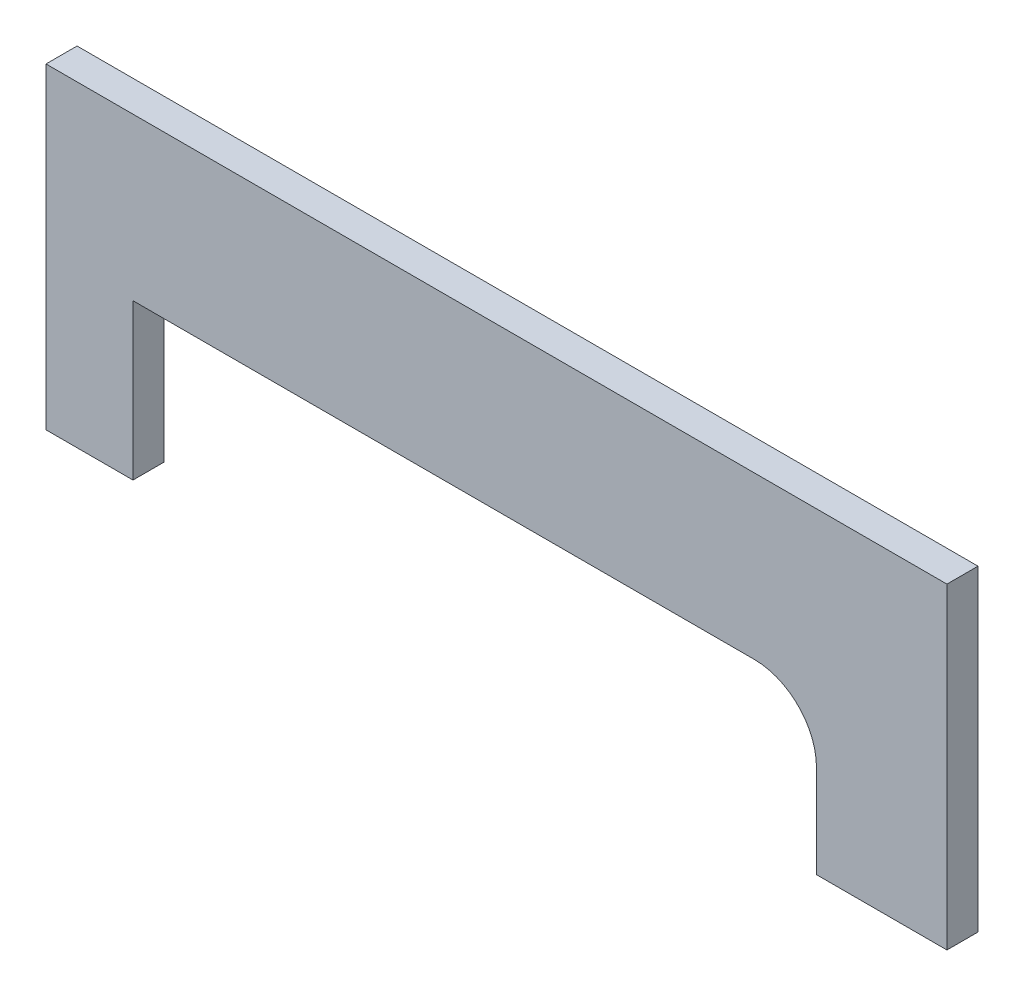
ISO-10303-21;
HEADER;
FILE_DESCRIPTION(('STEP AP214'),'2;1');
FILE_NAME('part.step','',(''),(''),'','','');
FILE_SCHEMA(('AUTOMOTIVE_DESIGN { 1 0 10303 214 1 1 1 1 }'));
ENDSEC;
DATA;
#1=APPLICATION_CONTEXT('core data for automotive mechanical design processes');
#2=APPLICATION_PROTOCOL_DEFINITION('international standard','automotive_design',2000,#1);
#3=PRODUCT_CONTEXT('',#1,'mechanical');
#4=PRODUCT('Part','Part','',(#3));
#5=PRODUCT_RELATED_PRODUCT_CATEGORY('part','',(#4));
#6=PRODUCT_DEFINITION_FORMATION('','',#4);
#7=PRODUCT_DEFINITION_CONTEXT('part definition',#1,'design');
#8=PRODUCT_DEFINITION('design','',#6,#7);
#9=PRODUCT_DEFINITION_SHAPE('','',#8);
#10=(LENGTH_UNIT() NAMED_UNIT(*) SI_UNIT(.MILLI.,.METRE.));
#11=(NAMED_UNIT(*) PLANE_ANGLE_UNIT() SI_UNIT($,.RADIAN.));
#12=(NAMED_UNIT(*) SI_UNIT($,.STERADIAN.) SOLID_ANGLE_UNIT());
#13=UNCERTAINTY_MEASURE_WITH_UNIT(LENGTH_MEASURE(1.E-05),#10,'distance_accuracy_value','');
#14=(GEOMETRIC_REPRESENTATION_CONTEXT(3) GLOBAL_UNCERTAINTY_ASSIGNED_CONTEXT((#13)) GLOBAL_UNIT_ASSIGNED_CONTEXT((#10,
#11,#12)) REPRESENTATION_CONTEXT('',''));
#15=CARTESIAN_POINT('',(0.,0.,0.));
#16=DIRECTION('',(0.,0.,1.));
#17=DIRECTION('',(1.,0.,0.));
#18=AXIS2_PLACEMENT_3D('',#15,#16,#17);
#19=CARTESIAN_POINT('',(-48.7494483294484,2.8376923076923,5.));
#20=DIRECTION('',(1.,0.,0.));
#21=DIRECTION('',(0.,1.,0.));
#22=AXIS2_PLACEMENT_3D('',#19,#20,#21);
#23=PLANE('',#22);
#24=DIRECTION('',(0.,-1.,0.));
#25=VECTOR('',#24,1.);
#26=CARTESIAN_POINT('',(-48.7494483294484,2.8376923076923,0.));
#27=LINE('',#26,#25);
#28=CARTESIAN_POINT('',(-48.7494483294484,2.8376923076923,0.));
#29=VERTEX_POINT('',#28);
#30=CARTESIAN_POINT('',(-48.7494483294484,-48.1623076923077,0.));
#31=VERTEX_POINT('',#30);
#32=EDGE_CURVE('E120',#29,#31,#27,.T.);
#33=ORIENTED_EDGE('',*,*,#32,.T.);
#34=DIRECTION('',(0.,0.,-1.));
#35=VECTOR('',#34,1.);
#36=CARTESIAN_POINT('',(-48.7494483294484,-48.1623076923077,5.));
#37=LINE('',#36,#35);
#38=CARTESIAN_POINT('',(-48.7494483294484,-48.1623076923077,5.));
#39=VERTEX_POINT('',#38);
#40=EDGE_CURVE('E11',#39,#31,#37,.T.);
#41=ORIENTED_EDGE('',*,*,#40,.F.);
#42=DIRECTION('',(0.,-1.,0.));
#43=VECTOR('',#42,1.);
#44=CARTESIAN_POINT('',(-48.7494483294484,2.8376923076923,5.));
#45=LINE('',#44,#43);
#46=CARTESIAN_POINT('',(-48.7494483294484,2.8376923076923,5.));
#47=VERTEX_POINT('',#46);
#48=EDGE_CURVE('E134',#47,#39,#45,.T.);
#49=ORIENTED_EDGE('',*,*,#48,.F.);
#50=DIRECTION('',(0.,0.,-1.));
#51=VECTOR('',#50,1.);
#52=CARTESIAN_POINT('',(-48.7494483294484,2.8376923076923,5.));
#53=LINE('',#52,#51);
#54=EDGE_CURVE('E116',#47,#29,#53,.T.);
#55=ORIENTED_EDGE('',*,*,#54,.T.);
#56=EDGE_LOOP('',(#33,#41,#49,#55));
#57=FACE_BOUND('',#56,.T.);
#58=ADVANCED_FACE('F30',(#57),#23,.F.);
#59=CARTESIAN_POINT('',(-48.7494483294484,-48.1623076923077,5.));
#60=DIRECTION('',(0.,1.,0.));
#61=DIRECTION('',(0.,0.,1.));
#62=AXIS2_PLACEMENT_3D('',#59,#60,#61);
#63=PLANE('',#62);
#64=DIRECTION('',(1.,0.,0.));
#65=VECTOR('',#64,1.);
#66=CARTESIAN_POINT('',(-48.7494483294484,-48.1623076923077,0.));
#67=LINE('',#66,#65);
#68=CARTESIAN_POINT('',(-34.7494483294484,-48.1623076923077,0.));
#69=VERTEX_POINT('',#68);
#70=EDGE_CURVE('E123',#31,#69,#67,.T.);
#71=ORIENTED_EDGE('',*,*,#70,.T.);
#72=DIRECTION('',(0.,0.,-1.));
#73=VECTOR('',#72,1.);
#74=CARTESIAN_POINT('',(-34.7494483294484,-48.1623076923077,5.));
#75=LINE('',#74,#73);
#76=CARTESIAN_POINT('',(-34.7494483294484,-48.1623076923077,5.));
#77=VERTEX_POINT('',#76);
#78=EDGE_CURVE('E38',#77,#69,#75,.T.);
#79=ORIENTED_EDGE('',*,*,#78,.F.);
#80=DIRECTION('',(1.,0.,0.));
#81=VECTOR('',#80,1.);
#82=CARTESIAN_POINT('',(-48.7494483294484,-48.1623076923077,5.));
#83=LINE('',#82,#81);
#84=EDGE_CURVE('E84',#39,#77,#83,.T.);
#85=ORIENTED_EDGE('',*,*,#84,.F.);
#86=ORIENTED_EDGE('',*,*,#40,.T.);
#87=EDGE_LOOP('',(#71,#79,#85,#86));
#88=FACE_BOUND('',#87,.T.);
#89=ADVANCED_FACE('F205',(#88),#63,.F.);
#90=CARTESIAN_POINT('',(-34.7494483294484,-48.1623076923077,5.));
#91=DIRECTION('',(-1.,0.,0.));
#92=DIRECTION('',(0.,0.,1.));
#93=AXIS2_PLACEMENT_3D('',#90,#91,#92);
#94=PLANE('',#93);
#95=DIRECTION('',(0.,1.,0.));
#96=VECTOR('',#95,1.);
#97=CARTESIAN_POINT('',(-34.7494483294484,-48.1623076923077,0.));
#98=LINE('',#97,#96);
#99=CARTESIAN_POINT('',(-34.7494483294484,-23.1623076923077,0.));
#100=VERTEX_POINT('',#99);
#101=EDGE_CURVE('E126',#69,#100,#98,.T.);
#102=ORIENTED_EDGE('',*,*,#101,.T.);
#103=DIRECTION('',(0.,0.,-1.));
#104=VECTOR('',#103,1.);
#105=CARTESIAN_POINT('',(-34.7494483294484,-23.1623076923077,5.));
#106=LINE('',#105,#104);
#107=CARTESIAN_POINT('',(-34.7494483294484,-23.1623076923077,5.));
#108=VERTEX_POINT('',#107);
#109=EDGE_CURVE('E111',#108,#100,#106,.T.);
#110=ORIENTED_EDGE('',*,*,#109,.F.);
#111=DIRECTION('',(0.,1.,0.));
#112=VECTOR('',#111,1.);
#113=CARTESIAN_POINT('',(-34.7494483294484,-48.1623076923077,5.));
#114=LINE('',#113,#112);
#115=EDGE_CURVE('E144',#77,#108,#114,.T.);
#116=ORIENTED_EDGE('',*,*,#115,.F.);
#117=ORIENTED_EDGE('',*,*,#78,.T.);
#118=EDGE_LOOP('',(#102,#110,#116,#117));
#119=FACE_BOUND('',#118,.T.);
#120=ADVANCED_FACE('F142',(#119),#94,.F.);
#121=CARTESIAN_POINT('',(-34.7494483294484,-23.1623076923077,5.));
#122=DIRECTION('',(0.,1.,0.));
#123=DIRECTION('',(0.,0.,1.));
#124=AXIS2_PLACEMENT_3D('',#121,#122,#123);
#125=PLANE('',#124);
#126=DIRECTION('',(1.,0.,0.));
#127=VECTOR('',#126,1.);
#128=CARTESIAN_POINT('',(-34.7494483294484,-23.1623076923077,0.));
#129=LINE('',#128,#127);
#130=CARTESIAN_POINT('',(65.2505516705516,-23.1623076923077,0.));
#131=VERTEX_POINT('',#130);
#132=EDGE_CURVE('E128',#100,#131,#129,.T.);
#133=ORIENTED_EDGE('',*,*,#132,.T.);
#134=DIRECTION('',(0.,0.,-1.));
#135=VECTOR('',#134,1.);
#136=CARTESIAN_POINT('',(65.2505516705516,-23.1623076923077,5.001));
#137=LINE('',#136,#135);
#138=CARTESIAN_POINT('',(65.2505516705516,-23.1623076923077,5.));
#139=VERTEX_POINT('',#138);
#140=EDGE_CURVE('E159',#139,#131,#137,.T.);
#141=ORIENTED_EDGE('',*,*,#140,.F.);
#142=DIRECTION('',(1.,0.,0.));
#143=VECTOR('',#142,1.);
#144=CARTESIAN_POINT('',(-34.7494483294484,-23.1623076923077,5.));
#145=LINE('',#144,#143);
#146=EDGE_CURVE('E105',#108,#139,#145,.T.);
#147=ORIENTED_EDGE('',*,*,#146,.F.);
#148=ORIENTED_EDGE('',*,*,#109,.T.);
#149=EDGE_LOOP('',(#133,#141,#147,#148));
#150=FACE_BOUND('',#149,.T.);
#151=ADVANCED_FACE('F157',(#150),#125,.F.);
#152=CARTESIAN_POINT('',(25.2505516705516,-48.1623076923077,5.));
#153=DIRECTION('',(0.,1.,0.));
#154=DIRECTION('',(0.,0.,1.));
#155=AXIS2_PLACEMENT_3D('',#152,#153,#154);
#156=PLANE('',#155);
#157=DIRECTION('',(1.,0.,0.));
#158=VECTOR('',#157,1.);
#159=CARTESIAN_POINT('',(25.2505516705516,-48.1623076923077,5.));
#160=LINE('',#159,#158);
#161=CARTESIAN_POINT('',(75.2505516705516,-48.1623076923077,5.));
#162=VERTEX_POINT('',#161);
#163=CARTESIAN_POINT('',(96.2505516705516,-48.1623076923077,5.));
#164=VERTEX_POINT('',#163);
#165=EDGE_CURVE('E94',#162,#164,#160,.T.);
#166=ORIENTED_EDGE('',*,*,#165,.F.);
#167=DIRECTION('',(0.,0.,-1.));
#168=VECTOR('',#167,1.);
#169=CARTESIAN_POINT('',(75.2505516705516,-48.1623076923077,5.001));
#170=LINE('',#169,#168);
#171=CARTESIAN_POINT('',(75.2505516705516,-48.1623076923077,0.));
#172=VERTEX_POINT('',#171);
#173=EDGE_CURVE('E124',#162,#172,#170,.T.);
#174=ORIENTED_EDGE('',*,*,#173,.T.);
#175=DIRECTION('',(1.,0.,0.));
#176=VECTOR('',#175,1.);
#177=CARTESIAN_POINT('',(25.2505516705516,-48.1623076923077,0.));
#178=LINE('',#177,#176);
#179=CARTESIAN_POINT('',(96.2505516705516,-48.1623076923077,0.));
#180=VERTEX_POINT('',#179);
#181=EDGE_CURVE('E110',#172,#180,#178,.T.);
#182=ORIENTED_EDGE('',*,*,#181,.T.);
#183=DIRECTION('',(0.,0.,-1.));
#184=VECTOR('',#183,1.);
#185=CARTESIAN_POINT('',(96.2505516705516,-48.1623076923077,5.));
#186=LINE('',#185,#184);
#187=EDGE_CURVE('E107',#164,#180,#186,.T.);
#188=ORIENTED_EDGE('',*,*,#187,.F.);
#189=EDGE_LOOP('',(#166,#174,#182,#188));
#190=FACE_BOUND('',#189,.T.);
#191=ADVANCED_FACE('F108',(#190),#156,.F.);
#192=CARTESIAN_POINT('',(96.2505516705516,2.8376923076923,5.));
#193=DIRECTION('',(-1.,0.,0.));
#194=DIRECTION('',(0.,0.,1.));
#195=AXIS2_PLACEMENT_3D('',#192,#193,#194);
#196=PLANE('',#195);
#197=DIRECTION('',(0.,1.,0.));
#198=VECTOR('',#197,1.);
#199=CARTESIAN_POINT('',(96.2505516705516,2.8376923076923,0.));
#200=LINE('',#199,#198);
#201=CARTESIAN_POINT('',(96.2505516705516,2.8376923076923,0.));
#202=VERTEX_POINT('',#201);
#203=EDGE_CURVE('E70',#180,#202,#200,.T.);
#204=ORIENTED_EDGE('',*,*,#203,.T.);
#205=DIRECTION('',(0.,0.,-1.));
#206=VECTOR('',#205,1.);
#207=CARTESIAN_POINT('',(96.2505516705516,2.8376923076923,5.));
#208=LINE('',#207,#206);
#209=CARTESIAN_POINT('',(96.2505516705516,2.8376923076923,5.));
#210=VERTEX_POINT('',#209);
#211=EDGE_CURVE('E112',#210,#202,#208,.T.);
#212=ORIENTED_EDGE('',*,*,#211,.F.);
#213=DIRECTION('',(0.,1.,0.));
#214=VECTOR('',#213,1.);
#215=CARTESIAN_POINT('',(96.2505516705516,2.8376923076923,5.));
#216=LINE('',#215,#214);
#217=EDGE_CURVE('E98',#164,#210,#216,.T.);
#218=ORIENTED_EDGE('',*,*,#217,.F.);
#219=ORIENTED_EDGE('',*,*,#187,.T.);
#220=EDGE_LOOP('',(#204,#212,#218,#219));
#221=FACE_BOUND('',#220,.T.);
#222=ADVANCED_FACE('F114',(#221),#196,.F.);
#223=CARTESIAN_POINT('',(-48.7494483294484,2.8376923076923,5.));
#224=DIRECTION('',(0.,-1.,0.));
#225=DIRECTION('',(0.,0.,-1.));
#226=AXIS2_PLACEMENT_3D('',#223,#224,#225);
#227=PLANE('',#226);
#228=DIRECTION('',(-1.,0.,0.));
#229=VECTOR('',#228,1.);
#230=CARTESIAN_POINT('',(-48.7494483294484,2.8376923076923,0.));
#231=LINE('',#230,#229);
#232=EDGE_CURVE('E76',#202,#29,#231,.T.);
#233=ORIENTED_EDGE('',*,*,#232,.T.);
#234=ORIENTED_EDGE('',*,*,#54,.F.);
#235=DIRECTION('',(-1.,0.,0.));
#236=VECTOR('',#235,1.);
#237=CARTESIAN_POINT('',(-48.7494483294484,2.8376923076923,5.));
#238=LINE('',#237,#236);
#239=EDGE_CURVE('E46',#210,#47,#238,.T.);
#240=ORIENTED_EDGE('',*,*,#239,.F.);
#241=ORIENTED_EDGE('',*,*,#211,.T.);
#242=EDGE_LOOP('',(#233,#234,#240,#241));
#243=FACE_BOUND('',#242,.T.);
#244=ADVANCED_FACE('F193',(#243),#227,.F.);
#245=CARTESIAN_POINT('',(-48.7494483294484,-48.1623076923077,5.));
#246=DIRECTION('',(0.,0.,1.));
#247=DIRECTION('',(1.,0.,0.));
#248=AXIS2_PLACEMENT_3D('',#245,#246,#247);
#249=PLANE('',#248);
#250=DIRECTION('',(0.,-1.,0.));
#251=VECTOR('',#250,1.);
#252=CARTESIAN_POINT('',(75.2505516705516,-33.1623076923077,5.));
#253=LINE('',#252,#251);
#254=CARTESIAN_POINT('',(75.2505516705516,-33.1623076923077,5.));
#255=VERTEX_POINT('',#254);
#256=EDGE_CURVE('E102',#255,#162,#253,.T.);
#257=ORIENTED_EDGE('',*,*,#256,.T.);
#258=ORIENTED_EDGE('',*,*,#165,.T.);
#259=ORIENTED_EDGE('',*,*,#217,.T.);
#260=ORIENTED_EDGE('',*,*,#239,.T.);
#261=ORIENTED_EDGE('',*,*,#48,.T.);
#262=ORIENTED_EDGE('',*,*,#84,.T.);
#263=ORIENTED_EDGE('',*,*,#115,.T.);
#264=ORIENTED_EDGE('',*,*,#146,.T.);
#265=CARTESIAN_POINT('',(65.2505516705516,-33.1623076923077,5.));
#266=DIRECTION('',(0.,0.,1.));
#267=DIRECTION('',(1.,0.,0.));
#268=AXIS2_PLACEMENT_3D('',#265,#266,#267);
#269=CIRCLE('',#268,9.99999999999999);
#270=EDGE_CURVE('E167',#139,#255,#269,.F.);
#271=ORIENTED_EDGE('',*,*,#270,.T.);
#272=EDGE_LOOP('',(#257,#258,#259,#260,#261,#262,#263,#264,#271));
#273=FACE_BOUND('',#272,.T.);
#274=ADVANCED_FACE('F96',(#273),#249,.T.);
#275=CARTESIAN_POINT('',(-48.7494483294484,-48.1623076923077,0.));
#276=DIRECTION('',(0.,0.,1.));
#277=DIRECTION('',(1.,0.,0.));
#278=AXIS2_PLACEMENT_3D('',#275,#276,#277);
#279=PLANE('',#278);
#280=ORIENTED_EDGE('',*,*,#181,.F.);
#281=DIRECTION('',(0.,-1.,0.));
#282=VECTOR('',#281,1.);
#283=CARTESIAN_POINT('',(75.2505516705516,-33.1623076923077,0.));
#284=LINE('',#283,#282);
#285=CARTESIAN_POINT('',(75.2505516705516,-33.1623076923077,0.));
#286=VERTEX_POINT('',#285);
#287=EDGE_CURVE('E169',#286,#172,#284,.T.);
#288=ORIENTED_EDGE('',*,*,#287,.F.);
#289=CARTESIAN_POINT('',(65.2505516705516,-33.1623076923077,0.));
#290=DIRECTION('',(0.,0.,-1.));
#291=DIRECTION('',(1.,0.,0.));
#292=AXIS2_PLACEMENT_3D('',#289,#290,#291);
#293=CIRCLE('',#292,9.99999999999999);
#294=EDGE_CURVE('E153',#131,#286,#293,.T.);
#295=ORIENTED_EDGE('',*,*,#294,.F.);
#296=ORIENTED_EDGE('',*,*,#132,.F.);
#297=ORIENTED_EDGE('',*,*,#101,.F.);
#298=ORIENTED_EDGE('',*,*,#70,.F.);
#299=ORIENTED_EDGE('',*,*,#32,.F.);
#300=ORIENTED_EDGE('',*,*,#232,.F.);
#301=ORIENTED_EDGE('',*,*,#203,.F.);
#302=EDGE_LOOP('',(#280,#288,#295,#296,#297,#298,#299,#300,#301));
#303=FACE_BOUND('',#302,.T.);
#304=ADVANCED_FACE('F147',(#303),#279,.F.);
#305=CARTESIAN_POINT('',(75.2505516705516,-33.1623076923077,5.001));
#306=DIRECTION('',(1.,0.,0.));
#307=DIRECTION('',(0.,1.,0.));
#308=AXIS2_PLACEMENT_3D('',#305,#306,#307);
#309=PLANE('',#308);
#310=DIRECTION('',(0.,0.,-1.));
#311=VECTOR('',#310,1.);
#312=CARTESIAN_POINT('',(75.2505516705516,-33.1623076923077,5.001));
#313=LINE('',#312,#311);
#314=EDGE_CURVE('E168',#255,#286,#313,.T.);
#315=ORIENTED_EDGE('',*,*,#314,.T.);
#316=ORIENTED_EDGE('',*,*,#287,.T.);
#317=ORIENTED_EDGE('',*,*,#173,.F.);
#318=ORIENTED_EDGE('',*,*,#256,.F.);
#319=EDGE_LOOP('',(#315,#316,#317,#318));
#320=FACE_BOUND('',#319,.T.);
#321=ADVANCED_FACE('F186',(#320),#309,.F.);
#322=CARTESIAN_POINT('',(65.2505516705516,-33.1623076923077,5.001));
#323=DIRECTION('',(0.,0.,-1.));
#324=DIRECTION('',(-1.,0.,0.));
#325=AXIS2_PLACEMENT_3D('',#322,#323,#324);
#326=CYLINDRICAL_SURFACE('',#325,9.99999999999999);
#327=ORIENTED_EDGE('',*,*,#140,.T.);
#328=ORIENTED_EDGE('',*,*,#294,.T.);
#329=ORIENTED_EDGE('',*,*,#314,.F.);
#330=ORIENTED_EDGE('',*,*,#270,.F.);
#331=EDGE_LOOP('',(#327,#328,#329,#330));
#332=FACE_BOUND('',#331,.T.);
#333=ADVANCED_FACE('F165',(#332),#326,.F.);
#334=CLOSED_SHELL('',(#58,#89,#120,#151,#191,#222,#244,#274,#304,#321,#333));
#335=MANIFOLD_SOLID_BREP('B2',#334);
#336=ADVANCED_BREP_SHAPE_REPRESENTATION('',(#18,#335),#14);
#337=SHAPE_DEFINITION_REPRESENTATION(#9,#336);
ENDSEC;
END-ISO-10303-21;
